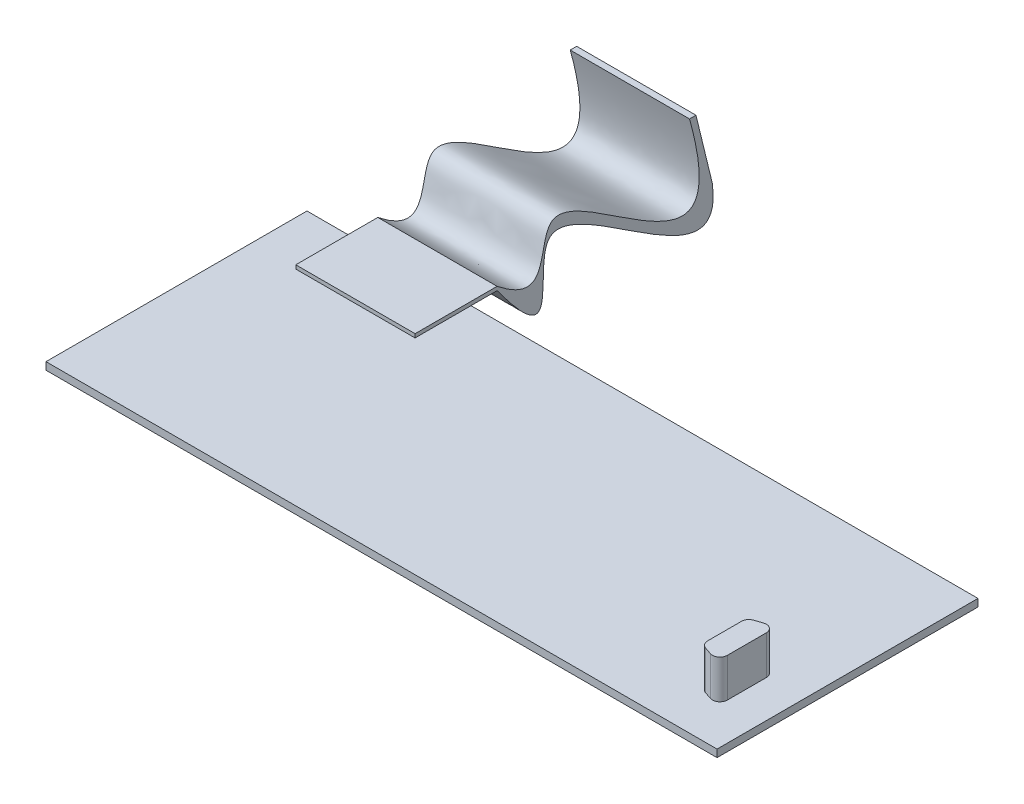
ISO-10303-21;
HEADER;
FILE_DESCRIPTION(('STEP AP214'),'2;1');
FILE_NAME('part.step','',(''),(''),'','','');
FILE_SCHEMA(('AUTOMOTIVE_DESIGN { 1 0 10303 214 1 1 1 1 }'));
ENDSEC;
DATA;
#1=APPLICATION_CONTEXT('core data for automotive mechanical design processes');
#2=APPLICATION_PROTOCOL_DEFINITION('international standard','automotive_design',2000,#1);
#3=PRODUCT_CONTEXT('',#1,'mechanical');
#4=PRODUCT('Part','Part','',(#3));
#5=PRODUCT_RELATED_PRODUCT_CATEGORY('part','',(#4));
#6=PRODUCT_DEFINITION_FORMATION('','',#4);
#7=PRODUCT_DEFINITION_CONTEXT('part definition',#1,'design');
#8=PRODUCT_DEFINITION('design','',#6,#7);
#9=PRODUCT_DEFINITION_SHAPE('','',#8);
#10=(LENGTH_UNIT() NAMED_UNIT(*) SI_UNIT(.MILLI.,.METRE.));
#11=(NAMED_UNIT(*) PLANE_ANGLE_UNIT() SI_UNIT($,.RADIAN.));
#12=(NAMED_UNIT(*) SI_UNIT($,.STERADIAN.) SOLID_ANGLE_UNIT());
#13=UNCERTAINTY_MEASURE_WITH_UNIT(LENGTH_MEASURE(1.E-05),#10,'distance_accuracy_value','');
#14=(GEOMETRIC_REPRESENTATION_CONTEXT(3) GLOBAL_UNCERTAINTY_ASSIGNED_CONTEXT((#13)) GLOBAL_UNIT_ASSIGNED_CONTEXT((#10,
#11,#12)) REPRESENTATION_CONTEXT('',''));
#15=CARTESIAN_POINT('',(0.,0.,0.));
#16=DIRECTION('',(0.,0.,1.));
#17=DIRECTION('',(1.,0.,0.));
#18=AXIS2_PLACEMENT_3D('',#15,#16,#17);
#19=CARTESIAN_POINT('',(0.,2.54,0.));
#20=DIRECTION('',(0.,1.,0.));
#21=DIRECTION('',(0.,0.,1.));
#22=AXIS2_PLACEMENT_3D('',#19,#20,#21);
#23=PLANE('',#22);
#24=DIRECTION('',(0.,0.,1.));
#25=VECTOR('',#24,1.);
#26=CARTESIAN_POINT('',(19.05,2.54,-107.95));
#27=LINE('',#26,#25);
#28=CARTESIAN_POINT('',(19.05,2.54,-107.95));
#29=VERTEX_POINT('',#28);
#30=CARTESIAN_POINT('',(19.05,2.54,-19.05));
#31=VERTEX_POINT('',#30);
#32=EDGE_CURVE('E451',#29,#31,#27,.T.);
#33=ORIENTED_EDGE('',*,*,#32,.T.);
#34=DIRECTION('',(1.,0.,0.));
#35=VECTOR('',#34,1.);
#36=CARTESIAN_POINT('',(19.05,2.54,-19.05));
#37=LINE('',#36,#35);
#38=CARTESIAN_POINT('',(247.65,2.54,-19.05));
#39=VERTEX_POINT('',#38);
#40=EDGE_CURVE('E454',#31,#39,#37,.T.);
#41=ORIENTED_EDGE('',*,*,#40,.T.);
#42=DIRECTION('',(0.,0.,-1.));
#43=VECTOR('',#42,1.);
#44=CARTESIAN_POINT('',(247.65,2.54,-107.95));
#45=LINE('',#44,#43);
#46=CARTESIAN_POINT('',(247.65,2.54,-107.95));
#47=VERTEX_POINT('',#46);
#48=EDGE_CURVE('E457',#39,#47,#45,.T.);
#49=ORIENTED_EDGE('',*,*,#48,.T.);
#50=DIRECTION('',(-1.,0.,0.));
#51=VECTOR('',#50,1.);
#52=CARTESIAN_POINT('',(19.05,2.54,-107.95));
#53=LINE('',#52,#51);
#54=EDGE_CURVE('E459',#47,#29,#53,.T.);
#55=ORIENTED_EDGE('',*,*,#54,.T.);
#56=EDGE_LOOP('',(#33,#41,#49,#55));
#57=FACE_BOUND('',#56,.T.);
#58=DIRECTION('',(1.,0.,0.));
#59=VECTOR('',#58,1.);
#60=CARTESIAN_POINT('',(40.64,2.54,-92.71));
#61=LINE('',#60,#59);
#62=CARTESIAN_POINT('',(40.64,2.54,-92.71));
#63=VERTEX_POINT('',#62);
#64=CARTESIAN_POINT('',(73.66,2.54,-92.71));
#65=VERTEX_POINT('',#64);
#66=EDGE_CURVE('E435',#63,#65,#61,.T.);
#67=ORIENTED_EDGE('',*,*,#66,.F.);
#68=DIRECTION('',(0.,0.,1.));
#69=VECTOR('',#68,1.);
#70=CARTESIAN_POINT('',(40.64,2.54,-97.79));
#71=LINE('',#70,#69);
#72=CARTESIAN_POINT('',(40.64,2.54,-97.79));
#73=VERTEX_POINT('',#72);
#74=EDGE_CURVE('E418',#73,#63,#71,.T.);
#75=ORIENTED_EDGE('',*,*,#74,.F.);
#76=DIRECTION('',(-1.,0.,0.));
#77=VECTOR('',#76,1.);
#78=CARTESIAN_POINT('',(40.64,2.54,-97.79));
#79=LINE('',#78,#77);
#80=CARTESIAN_POINT('',(73.66,2.54,-97.79));
#81=VERTEX_POINT('',#80);
#82=EDGE_CURVE('E423',#81,#73,#79,.T.);
#83=ORIENTED_EDGE('',*,*,#82,.F.);
#84=DIRECTION('',(0.,0.,-1.));
#85=VECTOR('',#84,1.);
#86=CARTESIAN_POINT('',(73.66,2.54,-97.79));
#87=LINE('',#86,#85);
#88=EDGE_CURVE('E437',#65,#81,#87,.T.);
#89=ORIENTED_EDGE('',*,*,#88,.F.);
#90=EDGE_LOOP('',(#67,#75,#83,#89));
#91=FACE_BOUND('',#90,.T.);
#92=DIRECTION('',(0.948683298050514,0.,0.316227766016838));
#93=VECTOR('',#92,1.);
#94=CARTESIAN_POINT('',(234.95,2.54,-31.75));
#95=LINE('',#94,#93);
#96=CARTESIAN_POINT('',(229.066781474317,2.54,-33.7110728418943));
#97=VERTEX_POINT('',#96);
#98=CARTESIAN_POINT('',(231.606781474317,2.54,-32.8644061752276));
#99=VERTEX_POINT('',#98);
#100=EDGE_CURVE('E339',#97,#99,#95,.T.);
#101=ORIENTED_EDGE('',*,*,#100,.F.);
#102=CARTESIAN_POINT('',(229.87,2.54,-36.1207284189426));
#103=DIRECTION('',(0.,1.,0.));
#104=DIRECTION('',(0.,0.,1.));
#105=AXIS2_PLACEMENT_3D('',#102,#103,#104);
#106=CIRCLE('',#105,2.54);
#107=CARTESIAN_POINT('',(227.33,2.54,-36.1207284189426));
#108=VERTEX_POINT('',#107);
#109=EDGE_CURVE('E42',#97,#108,#106,.F.);
#110=ORIENTED_EDGE('',*,*,#109,.T.);
#111=DIRECTION('',(0.,0.,1.));
#112=VECTOR('',#111,1.);
#113=CARTESIAN_POINT('',(227.33,2.54,-34.29));
#114=LINE('',#113,#112);
#115=CARTESIAN_POINT('',(227.33,2.54,-47.6992715810574));
#116=VERTEX_POINT('',#115);
#117=EDGE_CURVE('E338',#116,#108,#114,.T.);
#118=ORIENTED_EDGE('',*,*,#117,.F.);
#119=CARTESIAN_POINT('',(229.87,2.54,-47.6992715810574));
#120=DIRECTION('',(0.,1.,0.));
#121=DIRECTION('',(0.,0.,1.));
#122=AXIS2_PLACEMENT_3D('',#119,#120,#121);
#123=CIRCLE('',#122,2.54);
#124=CARTESIAN_POINT('',(229.066781474317,2.54,-50.1089271581057));
#125=VERTEX_POINT('',#124);
#126=EDGE_CURVE('E333',#116,#125,#123,.F.);
#127=ORIENTED_EDGE('',*,*,#126,.T.);
#128=DIRECTION('',(-0.948683298050513,0.,0.316227766016839));
#129=VECTOR('',#128,1.);
#130=CARTESIAN_POINT('',(227.33,2.54,-49.53));
#131=LINE('',#130,#129);
#132=CARTESIAN_POINT('',(231.606781474317,2.54,-50.9555938247724));
#133=VERTEX_POINT('',#132);
#134=EDGE_CURVE('E224',#133,#125,#131,.T.);
#135=ORIENTED_EDGE('',*,*,#134,.F.);
#136=CARTESIAN_POINT('',(232.41,2.54,-48.5459382477241));
#137=DIRECTION('',(0.,1.,0.));
#138=DIRECTION('',(0.,0.,1.));
#139=AXIS2_PLACEMENT_3D('',#136,#137,#138);
#140=CIRCLE('',#139,2.54);
#141=CARTESIAN_POINT('',(234.95,2.54,-48.5459382477241));
#142=VERTEX_POINT('',#141);
#143=EDGE_CURVE('E335',#133,#142,#140,.F.);
#144=ORIENTED_EDGE('',*,*,#143,.T.);
#145=DIRECTION('',(0.,0.,-1.));
#146=VECTOR('',#145,1.);
#147=CARTESIAN_POINT('',(234.95,2.54,-52.07));
#148=LINE('',#147,#146);
#149=CARTESIAN_POINT('',(234.95,2.54,-35.2740617522759));
#150=VERTEX_POINT('',#149);
#151=EDGE_CURVE('E347',#150,#142,#148,.T.);
#152=ORIENTED_EDGE('',*,*,#151,.F.);
#153=CARTESIAN_POINT('',(232.41,2.54,-35.2740617522759));
#154=DIRECTION('',(0.,1.,0.));
#155=DIRECTION('',(0.,0.,1.));
#156=AXIS2_PLACEMENT_3D('',#153,#154,#155);
#157=CIRCLE('',#156,2.54);
#158=EDGE_CURVE('E11',#150,#99,#157,.F.);
#159=ORIENTED_EDGE('',*,*,#158,.T.);
#160=EDGE_LOOP('',(#101,#110,#118,#127,#135,#144,#152,#159));
#161=FACE_BOUND('',#160,.T.);
#162=ADVANCED_FACE('F34',(#57,#91,#161),#23,.T.);
#163=CARTESIAN_POINT('',(19.05,2.54,-107.95));
#164=DIRECTION('',(1.,0.,0.));
#165=DIRECTION('',(0.,0.,-1.));
#166=AXIS2_PLACEMENT_3D('',#163,#164,#165);
#167=PLANE('',#166);
#168=DIRECTION('',(0.,0.,1.));
#169=VECTOR('',#168,1.);
#170=CARTESIAN_POINT('',(19.05,0.,-107.95));
#171=LINE('',#170,#169);
#172=CARTESIAN_POINT('',(19.05,0.,-107.95));
#173=VERTEX_POINT('',#172);
#174=CARTESIAN_POINT('',(19.05,0.,-19.05));
#175=VERTEX_POINT('',#174);
#176=EDGE_CURVE('E450',#173,#175,#171,.T.);
#177=ORIENTED_EDGE('',*,*,#176,.T.);
#178=DIRECTION('',(0.,-1.,0.));
#179=VECTOR('',#178,1.);
#180=CARTESIAN_POINT('',(19.05,2.54,-19.05));
#181=LINE('',#180,#179);
#182=EDGE_CURVE('E477',#31,#175,#181,.T.);
#183=ORIENTED_EDGE('',*,*,#182,.F.);
#184=ORIENTED_EDGE('',*,*,#32,.F.);
#185=DIRECTION('',(0.,-1.,0.));
#186=VECTOR('',#185,1.);
#187=CARTESIAN_POINT('',(19.05,2.54,-107.95));
#188=LINE('',#187,#186);
#189=EDGE_CURVE('E461',#29,#173,#188,.T.);
#190=ORIENTED_EDGE('',*,*,#189,.T.);
#191=EDGE_LOOP('',(#177,#183,#184,#190));
#192=FACE_BOUND('',#191,.T.);
#193=ADVANCED_FACE('F273',(#192),#167,.F.);
#194=CARTESIAN_POINT('',(19.05,2.54,-19.05));
#195=DIRECTION('',(0.,0.,-1.));
#196=DIRECTION('',(-1.,0.,0.));
#197=AXIS2_PLACEMENT_3D('',#194,#195,#196);
#198=PLANE('',#197);
#199=DIRECTION('',(1.,0.,0.));
#200=VECTOR('',#199,1.);
#201=CARTESIAN_POINT('',(19.05,0.,-19.05));
#202=LINE('',#201,#200);
#203=CARTESIAN_POINT('',(247.65,0.,-19.05));
#204=VERTEX_POINT('',#203);
#205=EDGE_CURVE('E464',#175,#204,#202,.T.);
#206=ORIENTED_EDGE('',*,*,#205,.T.);
#207=DIRECTION('',(0.,-1.,0.));
#208=VECTOR('',#207,1.);
#209=CARTESIAN_POINT('',(247.65,2.54,-19.05));
#210=LINE('',#209,#208);
#211=EDGE_CURVE('E474',#39,#204,#210,.T.);
#212=ORIENTED_EDGE('',*,*,#211,.F.);
#213=ORIENTED_EDGE('',*,*,#40,.F.);
#214=ORIENTED_EDGE('',*,*,#182,.T.);
#215=EDGE_LOOP('',(#206,#212,#213,#214));
#216=FACE_BOUND('',#215,.T.);
#217=ADVANCED_FACE('F285',(#216),#198,.F.);
#218=CARTESIAN_POINT('',(247.65,2.54,-107.95));
#219=DIRECTION('',(-1.,0.,0.));
#220=DIRECTION('',(0.,0.,1.));
#221=AXIS2_PLACEMENT_3D('',#218,#219,#220);
#222=PLANE('',#221);
#223=DIRECTION('',(0.,0.,-1.));
#224=VECTOR('',#223,1.);
#225=CARTESIAN_POINT('',(247.65,0.,-107.95));
#226=LINE('',#225,#224);
#227=CARTESIAN_POINT('',(247.65,0.,-107.95));
#228=VERTEX_POINT('',#227);
#229=EDGE_CURVE('E466',#204,#228,#226,.T.);
#230=ORIENTED_EDGE('',*,*,#229,.T.);
#231=DIRECTION('',(0.,-1.,0.));
#232=VECTOR('',#231,1.);
#233=CARTESIAN_POINT('',(247.65,2.54,-107.95));
#234=LINE('',#233,#232);
#235=EDGE_CURVE('E471',#47,#228,#234,.T.);
#236=ORIENTED_EDGE('',*,*,#235,.F.);
#237=ORIENTED_EDGE('',*,*,#48,.F.);
#238=ORIENTED_EDGE('',*,*,#211,.T.);
#239=EDGE_LOOP('',(#230,#236,#237,#238));
#240=FACE_BOUND('',#239,.T.);
#241=ADVANCED_FACE('F281',(#240),#222,.F.);
#242=CARTESIAN_POINT('',(19.05,2.54,-107.95));
#243=DIRECTION('',(0.,0.,1.));
#244=DIRECTION('',(1.,0.,0.));
#245=AXIS2_PLACEMENT_3D('',#242,#243,#244);
#246=PLANE('',#245);
#247=DIRECTION('',(-1.,0.,0.));
#248=VECTOR('',#247,1.);
#249=CARTESIAN_POINT('',(19.05,0.,-107.95));
#250=LINE('',#249,#248);
#251=EDGE_CURVE('E455',#228,#173,#250,.T.);
#252=ORIENTED_EDGE('',*,*,#251,.T.);
#253=ORIENTED_EDGE('',*,*,#189,.F.);
#254=ORIENTED_EDGE('',*,*,#54,.F.);
#255=ORIENTED_EDGE('',*,*,#235,.T.);
#256=EDGE_LOOP('',(#252,#253,#254,#255));
#257=FACE_BOUND('',#256,.T.);
#258=ADVANCED_FACE('F277',(#257),#246,.F.);
#259=CARTESIAN_POINT('',(0.,0.,0.));
#260=DIRECTION('',(0.,1.,0.));
#261=DIRECTION('',(0.,0.,1.));
#262=AXIS2_PLACEMENT_3D('',#259,#260,#261);
#263=PLANE('',#262);
#264=ORIENTED_EDGE('',*,*,#176,.F.);
#265=ORIENTED_EDGE('',*,*,#251,.F.);
#266=ORIENTED_EDGE('',*,*,#229,.F.);
#267=ORIENTED_EDGE('',*,*,#205,.F.);
#268=EDGE_LOOP('',(#264,#265,#266,#267));
#269=FACE_BOUND('',#268,.T.);
#270=ADVANCED_FACE('F269',(#269),#263,.F.);
#271=CARTESIAN_POINT('',(40.64,5.08,-97.79));
#272=DIRECTION('',(1.,0.,0.));
#273=DIRECTION('',(0.,0.,-1.));
#274=AXIS2_PLACEMENT_3D('',#271,#272,#273);
#275=PLANE('',#274);
#276=ORIENTED_EDGE('',*,*,#74,.T.);
#277=DIRECTION('',(0.,-1.,0.));
#278=VECTOR('',#277,1.);
#279=CARTESIAN_POINT('',(40.64,5.08,-92.71));
#280=LINE('',#279,#278);
#281=CARTESIAN_POINT('',(40.64,5.08,-92.71));
#282=VERTEX_POINT('',#281);
#283=EDGE_CURVE('E448',#282,#63,#280,.T.);
#284=ORIENTED_EDGE('',*,*,#283,.F.);
#285=DIRECTION('',(0.,0.,1.));
#286=VECTOR('',#285,1.);
#287=CARTESIAN_POINT('',(40.64,5.08,-97.79));
#288=LINE('',#287,#286);
#289=CARTESIAN_POINT('',(40.64,5.08,-97.79));
#290=VERTEX_POINT('',#289);
#291=EDGE_CURVE('E419',#290,#282,#288,.T.);
#292=ORIENTED_EDGE('',*,*,#291,.F.);
#293=DIRECTION('',(0.,-1.,0.));
#294=VECTOR('',#293,1.);
#295=CARTESIAN_POINT('',(40.64,5.08,-97.79));
#296=LINE('',#295,#294);
#297=EDGE_CURVE('E432',#290,#73,#296,.T.);
#298=ORIENTED_EDGE('',*,*,#297,.T.);
#299=EDGE_LOOP('',(#276,#284,#292,#298));
#300=FACE_BOUND('',#299,.T.);
#301=ADVANCED_FACE('F265',(#300),#275,.F.);
#302=CARTESIAN_POINT('',(40.64,5.08,-92.71));
#303=DIRECTION('',(0.,0.,-1.));
#304=DIRECTION('',(-1.,0.,0.));
#305=AXIS2_PLACEMENT_3D('',#302,#303,#304);
#306=PLANE('',#305);
#307=ORIENTED_EDGE('',*,*,#66,.T.);
#308=DIRECTION('',(0.,-1.,0.));
#309=VECTOR('',#308,1.);
#310=CARTESIAN_POINT('',(73.66,5.08,-92.71));
#311=LINE('',#310,#309);
#312=CARTESIAN_POINT('',(73.66,5.08,-92.71));
#313=VERTEX_POINT('',#312);
#314=EDGE_CURVE('E445',#313,#65,#311,.T.);
#315=ORIENTED_EDGE('',*,*,#314,.F.);
#316=DIRECTION('',(1.,0.,0.));
#317=VECTOR('',#316,1.);
#318=CARTESIAN_POINT('',(40.64,5.08,-92.71));
#319=LINE('',#318,#317);
#320=EDGE_CURVE('E422',#282,#313,#319,.T.);
#321=ORIENTED_EDGE('',*,*,#320,.F.);
#322=ORIENTED_EDGE('',*,*,#283,.T.);
#323=EDGE_LOOP('',(#307,#315,#321,#322));
#324=FACE_BOUND('',#323,.T.);
#325=ADVANCED_FACE('F261',(#324),#306,.F.);
#326=CARTESIAN_POINT('',(73.66,5.08,-97.79));
#327=DIRECTION('',(-1.,0.,0.));
#328=DIRECTION('',(0.,0.,1.));
#329=AXIS2_PLACEMENT_3D('',#326,#327,#328);
#330=PLANE('',#329);
#331=ORIENTED_EDGE('',*,*,#88,.T.);
#332=DIRECTION('',(0.,-1.,0.));
#333=VECTOR('',#332,1.);
#334=CARTESIAN_POINT('',(73.66,5.08,-97.79));
#335=LINE('',#334,#333);
#336=CARTESIAN_POINT('',(73.66,5.08,-97.79));
#337=VERTEX_POINT('',#336);
#338=EDGE_CURVE('E443',#337,#81,#335,.T.);
#339=ORIENTED_EDGE('',*,*,#338,.F.);
#340=DIRECTION('',(0.,0.,-1.));
#341=VECTOR('',#340,1.);
#342=CARTESIAN_POINT('',(73.66,5.08,-97.79));
#343=LINE('',#342,#341);
#344=EDGE_CURVE('E426',#313,#337,#343,.T.);
#345=ORIENTED_EDGE('',*,*,#344,.F.);
#346=ORIENTED_EDGE('',*,*,#314,.T.);
#347=EDGE_LOOP('',(#331,#339,#345,#346));
#348=FACE_BOUND('',#347,.T.);
#349=ADVANCED_FACE('F257',(#348),#330,.F.);
#350=CARTESIAN_POINT('',(40.64,5.08,-97.79));
#351=DIRECTION('',(0.,0.,1.));
#352=DIRECTION('',(1.,0.,0.));
#353=AXIS2_PLACEMENT_3D('',#350,#351,#352);
#354=PLANE('',#353);
#355=ORIENTED_EDGE('',*,*,#82,.T.);
#356=ORIENTED_EDGE('',*,*,#297,.F.);
#357=DIRECTION('',(-1.,0.,0.));
#358=VECTOR('',#357,1.);
#359=CARTESIAN_POINT('',(40.64,5.08,-97.79));
#360=LINE('',#359,#358);
#361=EDGE_CURVE('E429',#337,#290,#360,.T.);
#362=ORIENTED_EDGE('',*,*,#361,.F.);
#363=ORIENTED_EDGE('',*,*,#338,.T.);
#364=EDGE_LOOP('',(#355,#356,#362,#363));
#365=FACE_BOUND('',#364,.T.);
#366=ADVANCED_FACE('F244',(#365),#354,.F.);
#367=CARTESIAN_POINT('',(0.,5.08,0.));
#368=DIRECTION('',(0.,1.,0.));
#369=DIRECTION('',(0.,0.,1.));
#370=AXIS2_PLACEMENT_3D('',#367,#368,#369);
#371=PLANE('',#370);
#372=DIRECTION('',(0.,0.,1.));
#373=VECTOR('',#372,1.);
#374=CARTESIAN_POINT('',(36.83,5.08,-114.3));
#375=LINE('',#374,#373);
#376=CARTESIAN_POINT('',(36.83,5.08,-114.3));
#377=VERTEX_POINT('',#376);
#378=CARTESIAN_POINT('',(36.83,5.08,-86.36));
#379=VERTEX_POINT('',#378);
#380=EDGE_CURVE('E394',#377,#379,#375,.T.);
#381=ORIENTED_EDGE('',*,*,#380,.F.);
#382=DIRECTION('',(-1.,0.,0.));
#383=VECTOR('',#382,1.);
#384=CARTESIAN_POINT('',(36.83,5.08,-114.3));
#385=LINE('',#384,#383);
#386=CARTESIAN_POINT('',(77.47,5.08,-114.3));
#387=VERTEX_POINT('',#386);
#388=EDGE_CURVE('E400',#387,#377,#385,.T.);
#389=ORIENTED_EDGE('',*,*,#388,.F.);
#390=DIRECTION('',(0.,0.,-1.));
#391=VECTOR('',#390,1.);
#392=CARTESIAN_POINT('',(77.47,5.08,-114.3));
#393=LINE('',#392,#391);
#394=CARTESIAN_POINT('',(77.47,5.08,-86.36));
#395=VERTEX_POINT('',#394);
#396=EDGE_CURVE('E410',#395,#387,#393,.T.);
#397=ORIENTED_EDGE('',*,*,#396,.F.);
#398=DIRECTION('',(1.,0.,0.));
#399=VECTOR('',#398,1.);
#400=CARTESIAN_POINT('',(36.83,5.08,-86.36));
#401=LINE('',#400,#399);
#402=EDGE_CURVE('E408',#379,#395,#401,.T.);
#403=ORIENTED_EDGE('',*,*,#402,.F.);
#404=EDGE_LOOP('',(#381,#389,#397,#403));
#405=FACE_BOUND('',#404,.T.);
#406=ORIENTED_EDGE('',*,*,#361,.T.);
#407=ORIENTED_EDGE('',*,*,#291,.T.);
#408=ORIENTED_EDGE('',*,*,#320,.T.);
#409=ORIENTED_EDGE('',*,*,#344,.T.);
#410=EDGE_LOOP('',(#406,#407,#408,#409));
#411=FACE_BOUND('',#410,.T.);
#412=ADVANCED_FACE('F240',(#405,#411),#371,.F.);
#413=CARTESIAN_POINT('',(36.83,6.35,-114.3));
#414=DIRECTION('',(1.,0.,0.));
#415=DIRECTION('',(0.,0.,-1.));
#416=AXIS2_PLACEMENT_3D('',#413,#414,#415);
#417=PLANE('',#416);
#418=ORIENTED_EDGE('',*,*,#380,.T.);
#419=DIRECTION('',(0.,-1.,0.));
#420=VECTOR('',#419,1.);
#421=CARTESIAN_POINT('',(36.83,6.35,-86.36));
#422=LINE('',#421,#420);
#423=CARTESIAN_POINT('',(36.83,6.35,-86.36));
#424=VERTEX_POINT('',#423);
#425=EDGE_CURVE('E415',#424,#379,#422,.T.);
#426=ORIENTED_EDGE('',*,*,#425,.F.);
#427=DIRECTION('',(0.,0.,1.));
#428=VECTOR('',#427,1.);
#429=CARTESIAN_POINT('',(36.83,6.35,-114.3));
#430=LINE('',#429,#428);
#431=CARTESIAN_POINT('',(36.83,6.35,-114.3));
#432=VERTEX_POINT('',#431);
#433=EDGE_CURVE('E396',#432,#424,#430,.T.);
#434=ORIENTED_EDGE('',*,*,#433,.F.);
#435=CARTESIAN_POINT('',(36.83,6.35,-114.3));
#436=CARTESIAN_POINT('',(36.83,-8.81906553021901,-133.298148083789));
#437=CARTESIAN_POINT('',(36.83,54.6870695948696,-116.510356825169));
#438=CARTESIAN_POINT('',(36.83,-37.9471907271199,-196.650549714957));
#439=CARTESIAN_POINT('',(36.83,22.9559354816526,-179.858508248868));
#440=B_SPLINE_CURVE_WITH_KNOTS('',3,(#435,#436,#437,#438,#439),.UNSPECIFIED.,.F.,.F.,(4,1,4),
(0.,0.345555248067519,1.),.UNSPECIFIED.);
#441=CARTESIAN_POINT('',(36.83,22.9559354816526,-179.858508248868));
#442=VERTEX_POINT('',#441);
#443=EDGE_CURVE('E369',#432,#442,#440,.T.);
#444=ORIENTED_EDGE('',*,*,#443,.T.);
#445=DIRECTION('',(0.,0.,-1.));
#446=VECTOR('',#445,1.);
#447=CARTESIAN_POINT('',(36.83,22.9559354816526,-182.055573159444));
#448=LINE('',#447,#446);
#449=CARTESIAN_POINT('',(36.83,22.9559354816526,-182.055573159444));
#450=VERTEX_POINT('',#449);
#451=EDGE_CURVE('E193',#442,#450,#448,.T.);
#452=ORIENTED_EDGE('',*,*,#451,.T.);
#453=DIRECTION('',(0.,-0.971611366701,-0.236582653838812));
#454=VECTOR('',#453,1.);
#455=CARTESIAN_POINT('',(36.83,0.,-187.645232074245));
#456=LINE('',#455,#454);
#457=CARTESIAN_POINT('',(36.83,0.,-187.645232074245));
#458=VERTEX_POINT('',#457);
#459=EDGE_CURVE('E218',#450,#458,#456,.T.);
#460=ORIENTED_EDGE('',*,*,#459,.T.);
#461=CARTESIAN_POINT('',(36.83,0.,-187.645232074245));
#462=CARTESIAN_POINT('',(36.83,-34.2074087754966,-192.042694118437));
#463=CARTESIAN_POINT('',(36.83,56.2065382176591,-109.503597428272));
#464=CARTESIAN_POINT('',(36.83,-26.1349584181842,-136.98570851156));
#465=CARTESIAN_POINT('',(36.83,5.08,-114.3));
#466=B_SPLINE_CURVE_WITH_KNOTS('',3,(#461,#462,#463,#464,#465),.UNSPECIFIED.,.F.,.F.,(4,1,4),
(0.,0.617627208540911,1.),.UNSPECIFIED.);
#467=EDGE_CURVE('E215',#458,#377,#466,.T.);
#468=ORIENTED_EDGE('',*,*,#467,.T.);
#469=EDGE_LOOP('',(#418,#426,#434,#444,#452,#460,#468));
#470=FACE_BOUND('',#469,.T.);
#471=ADVANCED_FACE('F243',(#470),#417,.F.);
#472=CARTESIAN_POINT('',(36.83,6.35,-86.36));
#473=DIRECTION('',(0.,0.,-1.));
#474=DIRECTION('',(-1.,0.,0.));
#475=AXIS2_PLACEMENT_3D('',#472,#473,#474);
#476=PLANE('',#475);
#477=ORIENTED_EDGE('',*,*,#402,.T.);
#478=DIRECTION('',(0.,-1.,0.));
#479=VECTOR('',#478,1.);
#480=CARTESIAN_POINT('',(77.47,6.35,-86.36));
#481=LINE('',#480,#479);
#482=CARTESIAN_POINT('',(77.47,6.35,-86.36));
#483=VERTEX_POINT('',#482);
#484=EDGE_CURVE('E405',#483,#395,#481,.T.);
#485=ORIENTED_EDGE('',*,*,#484,.F.);
#486=DIRECTION('',(1.,0.,0.));
#487=VECTOR('',#486,1.);
#488=CARTESIAN_POINT('',(36.83,6.35,-86.36));
#489=LINE('',#488,#487);
#490=EDGE_CURVE('E399',#424,#483,#489,.T.);
#491=ORIENTED_EDGE('',*,*,#490,.F.);
#492=ORIENTED_EDGE('',*,*,#425,.T.);
#493=EDGE_LOOP('',(#477,#485,#491,#492));
#494=FACE_BOUND('',#493,.T.);
#495=ADVANCED_FACE('F248',(#494),#476,.F.);
#496=CARTESIAN_POINT('',(77.47,6.35,-114.3));
#497=DIRECTION('',(-1.,0.,0.));
#498=DIRECTION('',(0.,0.,1.));
#499=AXIS2_PLACEMENT_3D('',#496,#497,#498);
#500=PLANE('',#499);
#501=ORIENTED_EDGE('',*,*,#396,.T.);
#502=CARTESIAN_POINT('',(77.47,0.,-187.645232074245));
#503=CARTESIAN_POINT('',(77.47,-34.2074087754966,-192.042694118437));
#504=CARTESIAN_POINT('',(77.47,56.2065382176591,-109.503597428272));
#505=CARTESIAN_POINT('',(77.47,-26.1349584181842,-136.98570851156));
#506=CARTESIAN_POINT('',(77.47,5.08,-114.3));
#507=B_SPLINE_CURVE_WITH_KNOTS('',3,(#502,#503,#504,#505,#506),.UNSPECIFIED.,.F.,.F.,(4,1,4),
(0.,0.617627208540911,1.),.UNSPECIFIED.);
#508=CARTESIAN_POINT('',(77.47,0.,-187.645232074245));
#509=VERTEX_POINT('',#508);
#510=EDGE_CURVE('E198',#509,#387,#507,.T.);
#511=ORIENTED_EDGE('',*,*,#510,.F.);
#512=DIRECTION('',(0.,-0.971611366701,-0.236582653838812));
#513=VECTOR('',#512,1.);
#514=CARTESIAN_POINT('',(77.47,0.,-187.645232074245));
#515=LINE('',#514,#513);
#516=CARTESIAN_POINT('',(77.47,22.9559354816526,-182.055573159444));
#517=VERTEX_POINT('',#516);
#518=EDGE_CURVE('E210',#517,#509,#515,.T.);
#519=ORIENTED_EDGE('',*,*,#518,.F.);
#520=DIRECTION('',(0.,0.,-1.));
#521=VECTOR('',#520,1.);
#522=CARTESIAN_POINT('',(77.47,22.9559354816526,-182.055573159444));
#523=LINE('',#522,#521);
#524=CARTESIAN_POINT('',(77.47,22.9559354816526,-179.858508248868));
#525=VERTEX_POINT('',#524);
#526=EDGE_CURVE('E191',#525,#517,#523,.T.);
#527=ORIENTED_EDGE('',*,*,#526,.F.);
#528=CARTESIAN_POINT('',(77.47,6.35,-114.3));
#529=CARTESIAN_POINT('',(77.47,-8.81906553021901,-133.298148083789));
#530=CARTESIAN_POINT('',(77.47,54.6870695948696,-116.510356825169));
#531=CARTESIAN_POINT('',(77.47,-37.9471907271199,-196.650549714957));
#532=CARTESIAN_POINT('',(77.47,22.9559354816526,-179.858508248868));
#533=B_SPLINE_CURVE_WITH_KNOTS('',3,(#528,#529,#530,#531,#532),.UNSPECIFIED.,.F.,.F.,(4,1,4),
(0.,0.345555248067519,1.),.UNSPECIFIED.);
#534=CARTESIAN_POINT('',(77.47,6.35,-114.3));
#535=VERTEX_POINT('',#534);
#536=EDGE_CURVE('E206',#535,#525,#533,.T.);
#537=ORIENTED_EDGE('',*,*,#536,.F.);
#538=DIRECTION('',(0.,0.,-1.));
#539=VECTOR('',#538,1.);
#540=CARTESIAN_POINT('',(77.47,6.35,-114.3));
#541=LINE('',#540,#539);
#542=EDGE_CURVE('E402',#483,#535,#541,.T.);
#543=ORIENTED_EDGE('',*,*,#542,.F.);
#544=ORIENTED_EDGE('',*,*,#484,.T.);
#545=EDGE_LOOP('',(#501,#511,#519,#527,#537,#543,#544));
#546=FACE_BOUND('',#545,.T.);
#547=ADVANCED_FACE('F204',(#546),#500,.F.);
#548=CARTESIAN_POINT('',(0.,6.35,0.));
#549=DIRECTION('',(0.,1.,0.));
#550=DIRECTION('',(0.,0.,1.));
#551=AXIS2_PLACEMENT_3D('',#548,#549,#550);
#552=PLANE('',#551);
#553=ORIENTED_EDGE('',*,*,#433,.T.);
#554=ORIENTED_EDGE('',*,*,#490,.T.);
#555=ORIENTED_EDGE('',*,*,#542,.T.);
#556=DIRECTION('',(-1.,0.,0.));
#557=VECTOR('',#556,1.);
#558=CARTESIAN_POINT('',(36.83,6.35,-114.3));
#559=LINE('',#558,#557);
#560=EDGE_CURVE('E214',#535,#432,#559,.T.);
#561=ORIENTED_EDGE('',*,*,#560,.T.);
#562=EDGE_LOOP('',(#553,#554,#555,#561));
#563=FACE_BOUND('',#562,.T.);
#564=ADVANCED_FACE('F235',(#563),#552,.T.);
#565=DIRECTION('',(-1.,0.,0.));
#566=VECTOR('',#565,1.);
#567=SURFACE_OF_LINEAR_EXTRUSION('',#533,#566);
#568=ORIENTED_EDGE('',*,*,#443,.F.);
#569=ORIENTED_EDGE('',*,*,#560,.F.);
#570=ORIENTED_EDGE('',*,*,#536,.T.);
#571=DIRECTION('',(-1.,0.,0.));
#572=VECTOR('',#571,1.);
#573=CARTESIAN_POINT('',(77.47,22.9559354816526,-179.858508248868));
#574=LINE('',#573,#572);
#575=EDGE_CURVE('E188',#525,#442,#574,.T.);
#576=ORIENTED_EDGE('',*,*,#575,.T.);
#577=EDGE_LOOP('',(#568,#569,#570,#576));
#578=FACE_BOUND('',#577,.T.);
#579=ADVANCED_FACE('F212',(#578),#567,.T.);
#580=DIRECTION('',(-1.,0.,0.));
#581=VECTOR('',#580,1.);
#582=SURFACE_OF_LINEAR_EXTRUSION('',#507,#581);
#583=ORIENTED_EDGE('',*,*,#467,.F.);
#584=DIRECTION('',(-1.,0.,0.));
#585=VECTOR('',#584,1.);
#586=CARTESIAN_POINT('',(77.47,0.,-187.645232074245));
#587=LINE('',#586,#585);
#588=EDGE_CURVE('E389',#509,#458,#587,.T.);
#589=ORIENTED_EDGE('',*,*,#588,.F.);
#590=ORIENTED_EDGE('',*,*,#510,.T.);
#591=ORIENTED_EDGE('',*,*,#388,.T.);
#592=EDGE_LOOP('',(#583,#589,#590,#591));
#593=FACE_BOUND('',#592,.T.);
#594=ADVANCED_FACE('F234',(#593),#582,.T.);
#595=CARTESIAN_POINT('',(77.47,0.,-187.645232074245));
#596=DIRECTION('',(0.,0.236582653838811,-0.971611366701));
#597=DIRECTION('',(0.,0.971611366701,0.236582653838812));
#598=AXIS2_PLACEMENT_3D('',#595,#596,#597);
#599=PLANE('',#598);
#600=ORIENTED_EDGE('',*,*,#459,.F.);
#601=DIRECTION('',(-1.,0.,0.));
#602=VECTOR('',#601,1.);
#603=CARTESIAN_POINT('',(77.47,22.9559354816526,-182.055573159444));
#604=LINE('',#603,#602);
#605=EDGE_CURVE('E197',#517,#450,#604,.T.);
#606=ORIENTED_EDGE('',*,*,#605,.F.);
#607=ORIENTED_EDGE('',*,*,#518,.T.);
#608=ORIENTED_EDGE('',*,*,#588,.T.);
#609=EDGE_LOOP('',(#600,#606,#607,#608));
#610=FACE_BOUND('',#609,.T.);
#611=ADVANCED_FACE('F502',(#610),#599,.T.);
#612=CARTESIAN_POINT('',(77.47,22.9559354816526,-182.055573159444));
#613=DIRECTION('',(0.,1.,0.));
#614=DIRECTION('',(0.,0.,1.));
#615=AXIS2_PLACEMENT_3D('',#612,#613,#614);
#616=PLANE('',#615);
#617=ORIENTED_EDGE('',*,*,#451,.F.);
#618=ORIENTED_EDGE('',*,*,#575,.F.);
#619=ORIENTED_EDGE('',*,*,#526,.T.);
#620=ORIENTED_EDGE('',*,*,#605,.T.);
#621=EDGE_LOOP('',(#617,#618,#619,#620));
#622=FACE_BOUND('',#621,.T.);
#623=ADVANCED_FACE('F190',(#622),#616,.T.);
#624=CARTESIAN_POINT('',(227.33,15.748,-34.29));
#625=DIRECTION('',(1.,0.,0.));
#626=DIRECTION('',(0.,0.,-1.));
#627=AXIS2_PLACEMENT_3D('',#624,#625,#626);
#628=PLANE('',#627);
#629=DIRECTION('',(0.,0.,1.));
#630=VECTOR('',#629,1.);
#631=CARTESIAN_POINT('',(227.33,15.748,-34.29));
#632=LINE('',#631,#630);
#633=CARTESIAN_POINT('',(227.33,15.748,-47.6992715810574));
#634=VERTEX_POINT('',#633);
#635=CARTESIAN_POINT('',(227.33,15.748,-36.1207284189426));
#636=VERTEX_POINT('',#635);
#637=EDGE_CURVE('E356',#634,#636,#632,.T.);
#638=ORIENTED_EDGE('',*,*,#637,.F.);
#639=DIRECTION('',(0.,-1.,0.));
#640=VECTOR('',#639,1.);
#641=CARTESIAN_POINT('',(227.33,15.748,-47.6992715810574));
#642=LINE('',#641,#640);
#643=EDGE_CURVE('E345',#634,#116,#642,.T.);
#644=ORIENTED_EDGE('',*,*,#643,.T.);
#645=ORIENTED_EDGE('',*,*,#117,.T.);
#646=DIRECTION('',(0.,-1.,0.));
#647=VECTOR('',#646,1.);
#648=CARTESIAN_POINT('',(227.33,15.748,-36.1207284189426));
#649=LINE('',#648,#647);
#650=EDGE_CURVE('E309',#108,#636,#649,.F.);
#651=ORIENTED_EDGE('',*,*,#650,.T.);
#652=EDGE_LOOP('',(#638,#644,#645,#651));
#653=FACE_BOUND('',#652,.T.);
#654=ADVANCED_FACE('F343',(#653),#628,.F.);
#655=CARTESIAN_POINT('',(234.95,15.748,-31.75));
#656=DIRECTION('',(0.316227766016838,0.,-0.948683298050514));
#657=DIRECTION('',(-0.948683298050514,0.,-0.316227766016838));
#658=AXIS2_PLACEMENT_3D('',#655,#656,#657);
#659=PLANE('',#658);
#660=DIRECTION('',(0.948683298050514,0.,0.316227766016838));
#661=VECTOR('',#660,1.);
#662=CARTESIAN_POINT('',(234.95,15.748,-31.75));
#663=LINE('',#662,#661);
#664=CARTESIAN_POINT('',(229.066781474317,15.748,-33.7110728418943));
#665=VERTEX_POINT('',#664);
#666=CARTESIAN_POINT('',(231.606781474317,15.748,-32.8644061752276));
#667=VERTEX_POINT('',#666);
#668=EDGE_CURVE('E361',#665,#667,#663,.T.);
#669=ORIENTED_EDGE('',*,*,#668,.F.);
#670=DIRECTION('',(0.,-1.,0.));
#671=VECTOR('',#670,1.);
#672=CARTESIAN_POINT('',(229.066781474317,15.748,-33.7110728418943));
#673=LINE('',#672,#671);
#674=EDGE_CURVE('E310',#665,#97,#673,.T.);
#675=ORIENTED_EDGE('',*,*,#674,.T.);
#676=ORIENTED_EDGE('',*,*,#100,.T.);
#677=DIRECTION('',(0.,-1.,0.));
#678=VECTOR('',#677,1.);
#679=CARTESIAN_POINT('',(231.606781474317,15.748,-32.8644061752276));
#680=LINE('',#679,#678);
#681=EDGE_CURVE('E330',#99,#667,#680,.F.);
#682=ORIENTED_EDGE('',*,*,#681,.T.);
#683=EDGE_LOOP('',(#669,#675,#676,#682));
#684=FACE_BOUND('',#683,.T.);
#685=ADVANCED_FACE('F495',(#684),#659,.F.);
#686=CARTESIAN_POINT('',(234.95,15.748,-52.07));
#687=DIRECTION('',(-1.,0.,0.));
#688=DIRECTION('',(0.,0.,1.));
#689=AXIS2_PLACEMENT_3D('',#686,#687,#688);
#690=PLANE('',#689);
#691=ORIENTED_EDGE('',*,*,#151,.T.);
#692=DIRECTION('',(0.,-1.,0.));
#693=VECTOR('',#692,1.);
#694=CARTESIAN_POINT('',(234.95,15.748,-48.5459382477241));
#695=LINE('',#694,#693);
#696=CARTESIAN_POINT('',(234.95,15.748,-48.5459382477241));
#697=VERTEX_POINT('',#696);
#698=EDGE_CURVE('E328',#142,#697,#695,.F.);
#699=ORIENTED_EDGE('',*,*,#698,.T.);
#700=DIRECTION('',(0.,0.,-1.));
#701=VECTOR('',#700,1.);
#702=CARTESIAN_POINT('',(234.95,15.748,-52.07));
#703=LINE('',#702,#701);
#704=CARTESIAN_POINT('',(234.95,15.748,-35.2740617522759));
#705=VERTEX_POINT('',#704);
#706=EDGE_CURVE('E363',#705,#697,#703,.T.);
#707=ORIENTED_EDGE('',*,*,#706,.F.);
#708=DIRECTION('',(0.,-1.,0.));
#709=VECTOR('',#708,1.);
#710=CARTESIAN_POINT('',(234.95,15.748,-35.2740617522759));
#711=LINE('',#710,#709);
#712=EDGE_CURVE('E325',#705,#150,#711,.T.);
#713=ORIENTED_EDGE('',*,*,#712,.T.);
#714=EDGE_LOOP('',(#691,#699,#707,#713));
#715=FACE_BOUND('',#714,.T.);
#716=ADVANCED_FACE('F490',(#715),#690,.F.);
#717=CARTESIAN_POINT('',(227.33,15.748,-49.53));
#718=DIRECTION('',(0.316227766016839,0.,0.948683298050513));
#719=DIRECTION('',(0.948683298050513,0.,-0.316227766016839));
#720=AXIS2_PLACEMENT_3D('',#717,#718,#719);
#721=PLANE('',#720);
#722=ORIENTED_EDGE('',*,*,#134,.T.);
#723=DIRECTION('',(0.,-1.,0.));
#724=VECTOR('',#723,1.);
#725=CARTESIAN_POINT('',(229.066781474317,15.748,-50.1089271581057));
#726=LINE('',#725,#724);
#727=CARTESIAN_POINT('',(229.066781474317,15.748,-50.1089271581057));
#728=VERTEX_POINT('',#727);
#729=EDGE_CURVE('E320',#125,#728,#726,.F.);
#730=ORIENTED_EDGE('',*,*,#729,.T.);
#731=DIRECTION('',(-0.948683298050513,0.,0.316227766016839));
#732=VECTOR('',#731,1.);
#733=CARTESIAN_POINT('',(227.33,15.748,-49.53));
#734=LINE('',#733,#732);
#735=CARTESIAN_POINT('',(231.606781474317,15.748,-50.9555938247724));
#736=VERTEX_POINT('',#735);
#737=EDGE_CURVE('E350',#736,#728,#734,.T.);
#738=ORIENTED_EDGE('',*,*,#737,.F.);
#739=DIRECTION('',(0.,-1.,0.));
#740=VECTOR('',#739,1.);
#741=CARTESIAN_POINT('',(231.606781474317,15.748,-50.9555938247724));
#742=LINE('',#741,#740);
#743=EDGE_CURVE('E482',#736,#133,#742,.T.);
#744=ORIENTED_EDGE('',*,*,#743,.T.);
#745=EDGE_LOOP('',(#722,#730,#738,#744));
#746=FACE_BOUND('',#745,.T.);
#747=ADVANCED_FACE('F483',(#746),#721,.F.);
#748=CARTESIAN_POINT('',(0.,15.748,0.));
#749=DIRECTION('',(0.,-1.,0.));
#750=DIRECTION('',(0.,0.,-1.));
#751=AXIS2_PLACEMENT_3D('',#748,#749,#750);
#752=PLANE('',#751);
#753=ORIENTED_EDGE('',*,*,#737,.T.);
#754=CARTESIAN_POINT('',(229.87,15.748,-47.6992715810574));
#755=DIRECTION('',(0.,-1.,0.));
#756=DIRECTION('',(0.,0.,-1.));
#757=AXIS2_PLACEMENT_3D('',#754,#755,#756);
#758=CIRCLE('',#757,2.54);
#759=EDGE_CURVE('E318',#728,#634,#758,.F.);
#760=ORIENTED_EDGE('',*,*,#759,.T.);
#761=ORIENTED_EDGE('',*,*,#637,.T.);
#762=CARTESIAN_POINT('',(229.87,15.748,-36.1207284189426));
#763=DIRECTION('',(0.,-1.,0.));
#764=DIRECTION('',(0.,0.,-1.));
#765=AXIS2_PLACEMENT_3D('',#762,#763,#764);
#766=CIRCLE('',#765,2.54);
#767=EDGE_CURVE('E308',#636,#665,#766,.F.);
#768=ORIENTED_EDGE('',*,*,#767,.T.);
#769=ORIENTED_EDGE('',*,*,#668,.T.);
#770=CARTESIAN_POINT('',(232.41,15.748,-35.2740617522759));
#771=DIRECTION('',(0.,-1.,0.));
#772=DIRECTION('',(0.,0.,-1.));
#773=AXIS2_PLACEMENT_3D('',#770,#771,#772);
#774=CIRCLE('',#773,2.54);
#775=EDGE_CURVE('E316',#667,#705,#774,.F.);
#776=ORIENTED_EDGE('',*,*,#775,.T.);
#777=ORIENTED_EDGE('',*,*,#706,.T.);
#778=CARTESIAN_POINT('',(232.41,15.748,-48.5459382477241));
#779=DIRECTION('',(0.,-1.,0.));
#780=DIRECTION('',(0.,0.,-1.));
#781=AXIS2_PLACEMENT_3D('',#778,#779,#780);
#782=CIRCLE('',#781,2.54);
#783=EDGE_CURVE('E315',#697,#736,#782,.F.);
#784=ORIENTED_EDGE('',*,*,#783,.T.);
#785=EDGE_LOOP('',(#753,#760,#761,#768,#769,#776,#777,#784));
#786=FACE_BOUND('',#785,.T.);
#787=ADVANCED_FACE('F297',(#786),#752,.F.);
#788=CARTESIAN_POINT('',(229.87,15.748,-47.6992715810574));
#789=DIRECTION('',(0.,-1.,0.));
#790=DIRECTION('',(0.,0.,-1.));
#791=AXIS2_PLACEMENT_3D('',#788,#789,#790);
#792=CYLINDRICAL_SURFACE('',#791,2.54);
#793=ORIENTED_EDGE('',*,*,#759,.F.);
#794=ORIENTED_EDGE('',*,*,#729,.F.);
#795=ORIENTED_EDGE('',*,*,#126,.F.);
#796=ORIENTED_EDGE('',*,*,#643,.F.);
#797=EDGE_LOOP('',(#793,#794,#795,#796));
#798=FACE_BOUND('',#797,.T.);
#799=ADVANCED_FACE('F293',(#798),#792,.T.);
#800=CARTESIAN_POINT('',(232.41,15.748,-48.5459382477241));
#801=DIRECTION('',(0.,-1.,0.));
#802=DIRECTION('',(0.,0.,-1.));
#803=AXIS2_PLACEMENT_3D('',#800,#801,#802);
#804=CYLINDRICAL_SURFACE('',#803,2.54);
#805=ORIENTED_EDGE('',*,*,#783,.F.);
#806=ORIENTED_EDGE('',*,*,#698,.F.);
#807=ORIENTED_EDGE('',*,*,#143,.F.);
#808=ORIENTED_EDGE('',*,*,#743,.F.);
#809=EDGE_LOOP('',(#805,#806,#807,#808));
#810=FACE_BOUND('',#809,.T.);
#811=ADVANCED_FACE('F296',(#810),#804,.T.);
#812=CARTESIAN_POINT('',(229.87,15.748,-36.1207284189426));
#813=DIRECTION('',(0.,-1.,0.));
#814=DIRECTION('',(0.,0.,-1.));
#815=AXIS2_PLACEMENT_3D('',#812,#813,#814);
#816=CYLINDRICAL_SURFACE('',#815,2.54);
#817=ORIENTED_EDGE('',*,*,#767,.F.);
#818=ORIENTED_EDGE('',*,*,#650,.F.);
#819=ORIENTED_EDGE('',*,*,#109,.F.);
#820=ORIENTED_EDGE('',*,*,#674,.F.);
#821=EDGE_LOOP('',(#817,#818,#819,#820));
#822=FACE_BOUND('',#821,.T.);
#823=ADVANCED_FACE('F300',(#822),#816,.T.);
#824=CARTESIAN_POINT('',(232.41,15.748,-35.2740617522759));
#825=DIRECTION('',(0.,-1.,0.));
#826=DIRECTION('',(0.,0.,-1.));
#827=AXIS2_PLACEMENT_3D('',#824,#825,#826);
#828=CYLINDRICAL_SURFACE('',#827,2.54);
#829=ORIENTED_EDGE('',*,*,#775,.F.);
#830=ORIENTED_EDGE('',*,*,#681,.F.);
#831=ORIENTED_EDGE('',*,*,#158,.F.);
#832=ORIENTED_EDGE('',*,*,#712,.F.);
#833=EDGE_LOOP('',(#829,#830,#831,#832));
#834=FACE_BOUND('',#833,.T.);
#835=ADVANCED_FACE('F36',(#834),#828,.T.);
#836=CLOSED_SHELL('',(#162,#193,#217,#241,#258,#270,#301,#325,#349,#366,#412,#471,#495,#547,
#564,#579,#594,#611,#623,#654,#685,#716,#747,#787,#799,#811,#823,#835));
#837=MANIFOLD_SOLID_BREP('B2',#836);
#838=ADVANCED_BREP_SHAPE_REPRESENTATION('',(#18,#837),#14);
#839=SHAPE_DEFINITION_REPRESENTATION(#9,#838);
ENDSEC;
END-ISO-10303-21;
